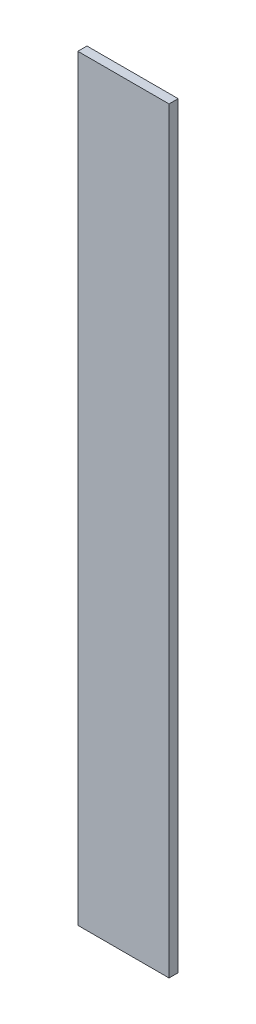
ISO-10303-21;
HEADER;
FILE_DESCRIPTION(('STEP AP214'),'2;1');
FILE_NAME('part.step','',(''),(''),'','','');
FILE_SCHEMA(('AUTOMOTIVE_DESIGN { 1 0 10303 214 1 1 1 1 }'));
ENDSEC;
DATA;
#1=APPLICATION_CONTEXT('core data for automotive mechanical design processes');
#2=APPLICATION_PROTOCOL_DEFINITION('international standard','automotive_design',2000,#1);
#3=PRODUCT_CONTEXT('',#1,'mechanical');
#4=PRODUCT('Part','Part','',(#3));
#5=PRODUCT_RELATED_PRODUCT_CATEGORY('part','',(#4));
#6=PRODUCT_DEFINITION_FORMATION('','',#4);
#7=PRODUCT_DEFINITION_CONTEXT('part definition',#1,'design');
#8=PRODUCT_DEFINITION('design','',#6,#7);
#9=PRODUCT_DEFINITION_SHAPE('','',#8);
#10=(LENGTH_UNIT() NAMED_UNIT(*) SI_UNIT(.MILLI.,.METRE.));
#11=(NAMED_UNIT(*) PLANE_ANGLE_UNIT() SI_UNIT($,.RADIAN.));
#12=(NAMED_UNIT(*) SI_UNIT($,.STERADIAN.) SOLID_ANGLE_UNIT());
#13=UNCERTAINTY_MEASURE_WITH_UNIT(LENGTH_MEASURE(1.E-05),#10,'distance_accuracy_value','');
#14=(GEOMETRIC_REPRESENTATION_CONTEXT(3) GLOBAL_UNCERTAINTY_ASSIGNED_CONTEXT((#13)) GLOBAL_UNIT_ASSIGNED_CONTEXT((#10,
#11,#12)) REPRESENTATION_CONTEXT('',''));
#15=CARTESIAN_POINT('',(0.,0.,0.));
#16=DIRECTION('',(0.,0.,1.));
#17=DIRECTION('',(1.,0.,0.));
#18=AXIS2_PLACEMENT_3D('',#15,#16,#17);
#19=CARTESIAN_POINT('',(0.,0.,1.));
#20=DIRECTION('',(1.,0.,0.));
#21=DIRECTION('',(0.,0.,-1.));
#22=AXIS2_PLACEMENT_3D('',#19,#20,#21);
#23=PLANE('',#22);
#24=DIRECTION('',(0.,-1.,0.));
#25=VECTOR('',#24,1.);
#26=CARTESIAN_POINT('',(0.,0.,0.));
#27=LINE('',#26,#25);
#28=CARTESIAN_POINT('',(0.,83.,0.));
#29=VERTEX_POINT('',#28);
#30=CARTESIAN_POINT('',(0.,0.,0.));
#31=VERTEX_POINT('',#30);
#32=EDGE_CURVE('E107',#29,#31,#27,.T.);
#33=ORIENTED_EDGE('',*,*,#32,.T.);
#34=DIRECTION('',(0.,0.,-1.));
#35=VECTOR('',#34,1.);
#36=CARTESIAN_POINT('',(0.,0.,1.));
#37=LINE('',#36,#35);
#38=CARTESIAN_POINT('',(0.,0.,1.));
#39=VERTEX_POINT('',#38);
#40=EDGE_CURVE('E11',#39,#31,#37,.T.);
#41=ORIENTED_EDGE('',*,*,#40,.F.);
#42=DIRECTION('',(0.,-1.,0.));
#43=VECTOR('',#42,1.);
#44=CARTESIAN_POINT('',(0.,0.,1.));
#45=LINE('',#44,#43);
#46=CARTESIAN_POINT('',(0.,83.,1.));
#47=VERTEX_POINT('',#46);
#48=EDGE_CURVE('E91',#47,#39,#45,.T.);
#49=ORIENTED_EDGE('',*,*,#48,.F.);
#50=DIRECTION('',(0.,0.,-1.));
#51=VECTOR('',#50,1.);
#52=CARTESIAN_POINT('',(0.,83.,1.));
#53=LINE('',#52,#51);
#54=EDGE_CURVE('E103',#47,#29,#53,.T.);
#55=ORIENTED_EDGE('',*,*,#54,.T.);
#56=EDGE_LOOP('',(#33,#41,#49,#55));
#57=FACE_BOUND('',#56,.T.);
#58=ADVANCED_FACE('F39',(#57),#23,.F.);
#59=CARTESIAN_POINT('',(0.,0.,1.));
#60=DIRECTION('',(0.,1.,0.));
#61=DIRECTION('',(0.,0.,1.));
#62=AXIS2_PLACEMENT_3D('',#59,#60,#61);
#63=PLANE('',#62);
#64=DIRECTION('',(1.,0.,0.));
#65=VECTOR('',#64,1.);
#66=CARTESIAN_POINT('',(0.,0.,0.));
#67=LINE('',#66,#65);
#68=CARTESIAN_POINT('',(10.,0.,0.));
#69=VERTEX_POINT('',#68);
#70=EDGE_CURVE('E96',#31,#69,#67,.T.);
#71=ORIENTED_EDGE('',*,*,#70,.T.);
#72=DIRECTION('',(0.,0.,-1.));
#73=VECTOR('',#72,1.);
#74=CARTESIAN_POINT('',(10.,0.,1.));
#75=LINE('',#74,#73);
#76=CARTESIAN_POINT('',(10.,0.,1.));
#77=VERTEX_POINT('',#76);
#78=EDGE_CURVE('E48',#77,#69,#75,.T.);
#79=ORIENTED_EDGE('',*,*,#78,.F.);
#80=DIRECTION('',(1.,0.,0.));
#81=VECTOR('',#80,1.);
#82=CARTESIAN_POINT('',(0.,0.,1.));
#83=LINE('',#82,#81);
#84=EDGE_CURVE('E86',#39,#77,#83,.T.);
#85=ORIENTED_EDGE('',*,*,#84,.F.);
#86=ORIENTED_EDGE('',*,*,#40,.T.);
#87=EDGE_LOOP('',(#71,#79,#85,#86));
#88=FACE_BOUND('',#87,.T.);
#89=ADVANCED_FACE('F95',(#88),#63,.F.);
#90=CARTESIAN_POINT('',(10.,0.,1.));
#91=DIRECTION('',(-1.,0.,0.));
#92=DIRECTION('',(0.,0.,1.));
#93=AXIS2_PLACEMENT_3D('',#90,#91,#92);
#94=PLANE('',#93);
#95=DIRECTION('',(0.,1.,0.));
#96=VECTOR('',#95,1.);
#97=CARTESIAN_POINT('',(10.,0.,0.));
#98=LINE('',#97,#96);
#99=CARTESIAN_POINT('',(10.,83.,0.));
#100=VERTEX_POINT('',#99);
#101=EDGE_CURVE('E73',#69,#100,#98,.T.);
#102=ORIENTED_EDGE('',*,*,#101,.T.);
#103=DIRECTION('',(0.,0.,-1.));
#104=VECTOR('',#103,1.);
#105=CARTESIAN_POINT('',(10.,83.,1.));
#106=LINE('',#105,#104);
#107=CARTESIAN_POINT('',(10.,83.,1.));
#108=VERTEX_POINT('',#107);
#109=EDGE_CURVE('E98',#108,#100,#106,.T.);
#110=ORIENTED_EDGE('',*,*,#109,.F.);
#111=DIRECTION('',(0.,1.,0.));
#112=VECTOR('',#111,1.);
#113=CARTESIAN_POINT('',(10.,0.,1.));
#114=LINE('',#113,#112);
#115=EDGE_CURVE('E89',#77,#108,#114,.T.);
#116=ORIENTED_EDGE('',*,*,#115,.F.);
#117=ORIENTED_EDGE('',*,*,#78,.T.);
#118=EDGE_LOOP('',(#102,#110,#116,#117));
#119=FACE_BOUND('',#118,.T.);
#120=ADVANCED_FACE('F99',(#119),#94,.F.);
#121=CARTESIAN_POINT('',(0.,83.,1.));
#122=DIRECTION('',(0.,-1.,0.));
#123=DIRECTION('',(0.,0.,-1.));
#124=AXIS2_PLACEMENT_3D('',#121,#122,#123);
#125=PLANE('',#124);
#126=DIRECTION('',(-1.,0.,0.));
#127=VECTOR('',#126,1.);
#128=CARTESIAN_POINT('',(0.,83.,0.));
#129=LINE('',#128,#127);
#130=EDGE_CURVE('E79',#100,#29,#129,.T.);
#131=ORIENTED_EDGE('',*,*,#130,.T.);
#132=ORIENTED_EDGE('',*,*,#54,.F.);
#133=DIRECTION('',(-1.,0.,0.));
#134=VECTOR('',#133,1.);
#135=CARTESIAN_POINT('',(0.,83.,1.));
#136=LINE('',#135,#134);
#137=EDGE_CURVE('E56',#108,#47,#136,.T.);
#138=ORIENTED_EDGE('',*,*,#137,.F.);
#139=ORIENTED_EDGE('',*,*,#109,.T.);
#140=EDGE_LOOP('',(#131,#132,#138,#139));
#141=FACE_BOUND('',#140,.T.);
#142=ADVANCED_FACE('F120',(#141),#125,.F.);
#143=CARTESIAN_POINT('',(0.,0.,1.));
#144=DIRECTION('',(0.,0.,-1.));
#145=DIRECTION('',(-1.,0.,0.));
#146=AXIS2_PLACEMENT_3D('',#143,#144,#145);
#147=PLANE('',#146);
#148=ORIENTED_EDGE('',*,*,#48,.T.);
#149=ORIENTED_EDGE('',*,*,#84,.T.);
#150=ORIENTED_EDGE('',*,*,#115,.T.);
#151=ORIENTED_EDGE('',*,*,#137,.T.);
#152=EDGE_LOOP('',(#148,#149,#150,#151));
#153=FACE_BOUND('',#152,.T.);
#154=ADVANCED_FACE('F87',(#153),#147,.F.);
#155=CARTESIAN_POINT('',(0.,0.,0.));
#156=DIRECTION('',(0.,0.,-1.));
#157=DIRECTION('',(-1.,0.,0.));
#158=AXIS2_PLACEMENT_3D('',#155,#156,#157);
#159=PLANE('',#158);
#160=ORIENTED_EDGE('',*,*,#32,.F.);
#161=ORIENTED_EDGE('',*,*,#130,.F.);
#162=ORIENTED_EDGE('',*,*,#101,.F.);
#163=ORIENTED_EDGE('',*,*,#70,.F.);
#164=EDGE_LOOP('',(#160,#161,#162,#163));
#165=FACE_BOUND('',#164,.T.);
#166=ADVANCED_FACE('F123',(#165),#159,.T.);
#167=CLOSED_SHELL('',(#58,#89,#120,#142,#154,#166));
#168=MANIFOLD_SOLID_BREP('B2',#167);
#169=ADVANCED_BREP_SHAPE_REPRESENTATION('',(#18,#168),#14);
#170=SHAPE_DEFINITION_REPRESENTATION(#9,#169);
ENDSEC;
END-ISO-10303-21;
